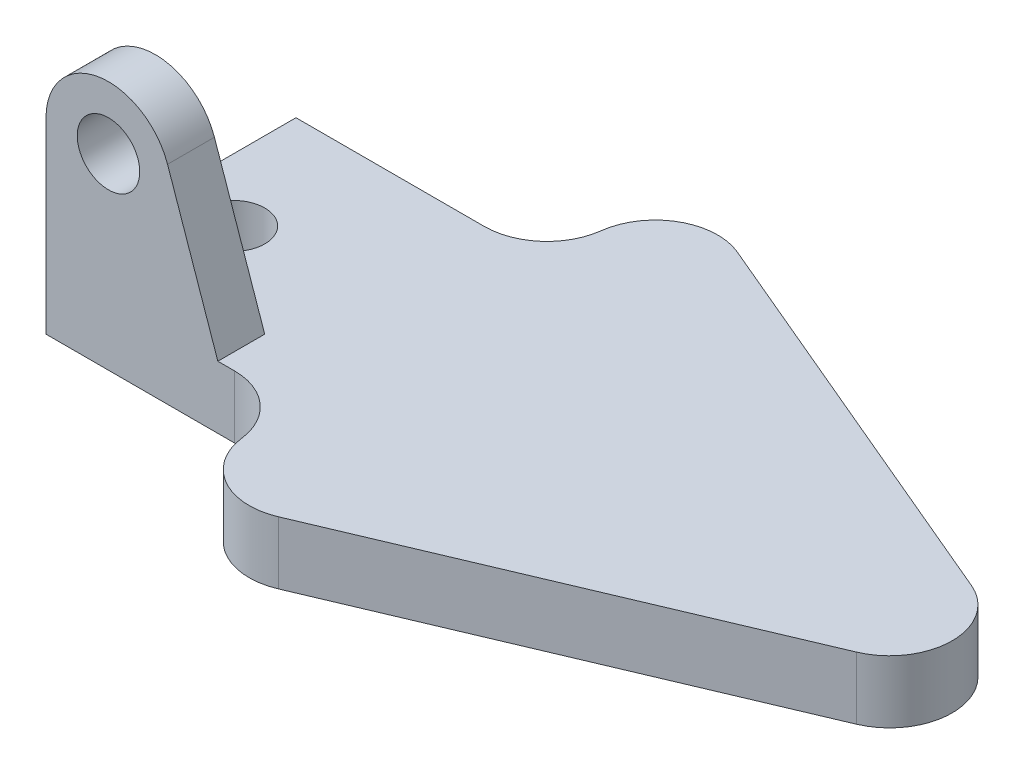
ISO-10303-21;
HEADER;
FILE_DESCRIPTION(('STEP AP214'),'2;1');
FILE_NAME('part.step','',(''),(''),'','','');
FILE_SCHEMA(('AUTOMOTIVE_DESIGN { 1 0 10303 214 1 1 1 1 }'));
ENDSEC;
DATA;
#1=APPLICATION_CONTEXT('core data for automotive mechanical design processes');
#2=APPLICATION_PROTOCOL_DEFINITION('international standard','automotive_design',2000,#1);
#3=PRODUCT_CONTEXT('',#1,'mechanical');
#4=PRODUCT('Part','Part','',(#3));
#5=PRODUCT_RELATED_PRODUCT_CATEGORY('part','',(#4));
#6=PRODUCT_DEFINITION_FORMATION('','',#4);
#7=PRODUCT_DEFINITION_CONTEXT('part definition',#1,'design');
#8=PRODUCT_DEFINITION('design','',#6,#7);
#9=PRODUCT_DEFINITION_SHAPE('','',#8);
#10=(LENGTH_UNIT() NAMED_UNIT(*) SI_UNIT(.MILLI.,.METRE.));
#11=(NAMED_UNIT(*) PLANE_ANGLE_UNIT() SI_UNIT($,.RADIAN.));
#12=(NAMED_UNIT(*) SI_UNIT($,.STERADIAN.) SOLID_ANGLE_UNIT());
#13=UNCERTAINTY_MEASURE_WITH_UNIT(LENGTH_MEASURE(1.E-05),#10,'distance_accuracy_value','');
#14=(GEOMETRIC_REPRESENTATION_CONTEXT(3) GLOBAL_UNCERTAINTY_ASSIGNED_CONTEXT((#13)) GLOBAL_UNIT_ASSIGNED_CONTEXT((#10,
#11,#12)) REPRESENTATION_CONTEXT('',''));
#15=CARTESIAN_POINT('',(0.,0.,0.));
#16=DIRECTION('',(0.,0.,1.));
#17=DIRECTION('',(1.,0.,0.));
#18=AXIS2_PLACEMENT_3D('',#15,#16,#17);
#19=CARTESIAN_POINT('',(-16.9663877764453,20.,-43.3264019782518));
#20=DIRECTION('',(0.,1.,0.));
#21=DIRECTION('',(0.,0.,1.));
#22=AXIS2_PLACEMENT_3D('',#19,#20,#21);
#23=PLANE('',#22);
#24=CARTESIAN_POINT('',(-57.2801181104764,20.,16.6735980217483));
#25=DIRECTION('',(0.,1.,0.));
#26=DIRECTION('',(0.,0.,1.));
#27=AXIS2_PLACEMENT_3D('',#24,#25,#26);
#28=CIRCLE('',#27,10.);
#29=CARTESIAN_POINT('',(-57.2801181104764,20.,26.6735980217483));
#30=VERTEX_POINT('',#29);
#31=EDGE_CURVE('E163',#30,#30,#28,.T.);
#32=ORIENTED_EDGE('',*,*,#31,.F.);
#33=EDGE_LOOP('',(#32));
#34=FACE_BOUND('',#33,.T.);
#35=DIRECTION('',(0.,0.,1.));
#36=VECTOR('',#35,1.);
#37=CARTESIAN_POINT('',(-77.2801181104764,20.,56.6735980217483));
#38=LINE('',#37,#36);
#39=CARTESIAN_POINT('',(-77.2801181104764,20.,-23.3264019782517));
#40=VERTEX_POINT('',#39);
#41=CARTESIAN_POINT('',(-77.2801181104764,20.,41.6735980217482));
#42=VERTEX_POINT('',#41);
#43=EDGE_CURVE('E112',#40,#42,#38,.T.);
#44=ORIENTED_EDGE('',*,*,#43,.T.);
#45=DIRECTION('',(1.,0.,0.));
#46=VECTOR('',#45,1.);
#47=CARTESIAN_POINT('',(-77.2801181104764,20.,41.6735980217482));
#48=LINE('',#47,#46);
#49=CARTESIAN_POINT('',(-22.2801181104764,20.,41.6735980217482));
#50=VERTEX_POINT('',#49);
#51=EDGE_CURVE('E246',#42,#50,#48,.T.);
#52=ORIENTED_EDGE('',*,*,#51,.T.);
#53=DIRECTION('',(0.,0.,1.));
#54=VECTOR('',#53,1.);
#55=CARTESIAN_POINT('',(-22.2801181104764,20.,41.6735980217482));
#56=LINE('',#55,#54);
#57=CARTESIAN_POINT('',(-22.2801181104764,20.,56.6735980217482));
#58=VERTEX_POINT('',#57);
#59=EDGE_CURVE('E239',#50,#58,#56,.T.);
#60=ORIENTED_EDGE('',*,*,#59,.T.);
#61=DIRECTION('',(1.,0.,0.));
#62=VECTOR('',#61,1.);
#63=CARTESIAN_POINT('',(-77.2801181104764,20.,56.6735980217483));
#64=LINE('',#63,#62);
#65=CARTESIAN_POINT('',(-16.9663877764453,20.,56.6735980217482));
#66=VERTEX_POINT('',#65);
#67=EDGE_CURVE('E227',#58,#66,#64,.T.);
#68=ORIENTED_EDGE('',*,*,#67,.T.);
#69=CARTESIAN_POINT('',(-16.9663877764453,20.,76.6735980217483));
#70=DIRECTION('',(0.,-1.,0.));
#71=DIRECTION('',(0.,0.,-1.));
#72=AXIS2_PLACEMENT_3D('',#69,#70,#71);
#73=CIRCLE('',#72,20.);
#74=CARTESIAN_POINT('',(2.87674705653915,20.,74.1735980217483));
#75=VERTEX_POINT('',#74);
#76=EDGE_CURVE('E224',#66,#75,#73,.T.);
#77=ORIENTED_EDGE('',*,*,#76,.T.);
#78=CARTESIAN_POINT('',(22.7198818895236,20.,71.6735980217482));
#79=DIRECTION('',(0.,1.,0.));
#80=DIRECTION('',(0.,0.,1.));
#81=AXIS2_PLACEMENT_3D('',#78,#79,#80);
#82=CIRCLE('',#81,20.);
#83=CARTESIAN_POINT('',(30.5126817062575,20.,90.0929430431194));
#84=VERTEX_POINT('',#83);
#85=EDGE_CURVE('E221',#75,#84,#82,.T.);
#86=ORIENTED_EDGE('',*,*,#85,.T.);
#87=DIRECTION('',(0.920967251068559,0.,-0.389639990836698));
#88=VECTOR('',#87,1.);
#89=CARTESIAN_POINT('',(30.5126817062575,20.,90.0929430431194));
#90=LINE('',#89,#88);
#91=CARTESIAN_POINT('',(160.512681706258,20.,35.0929430431194));
#92=VERTEX_POINT('',#91);
#93=EDGE_CURVE('E223',#84,#92,#90,.T.);
#94=ORIENTED_EDGE('',*,*,#93,.T.);
#95=CARTESIAN_POINT('',(152.719881889524,20.,16.6735980217483));
#96=DIRECTION('',(0.,1.,0.));
#97=DIRECTION('',(0.,0.,1.));
#98=AXIS2_PLACEMENT_3D('',#95,#96,#97);
#99=CIRCLE('',#98,20.);
#100=CARTESIAN_POINT('',(160.512681706258,20.,-1.74574699962293));
#101=VERTEX_POINT('',#100);
#102=EDGE_CURVE('E138',#92,#101,#99,.T.);
#103=ORIENTED_EDGE('',*,*,#102,.T.);
#104=DIRECTION('',(-0.920967251068559,0.,-0.389639990836698));
#105=VECTOR('',#104,1.);
#106=CARTESIAN_POINT('',(30.5126817062575,20.,-56.7457469996229));
#107=LINE('',#106,#105);
#108=CARTESIAN_POINT('',(30.5126817062575,20.,-56.7457469996229));
#109=VERTEX_POINT('',#108);
#110=EDGE_CURVE('E132',#101,#109,#107,.T.);
#111=ORIENTED_EDGE('',*,*,#110,.T.);
#112=CARTESIAN_POINT('',(22.7198818895236,20.,-38.3264019782517));
#113=DIRECTION('',(0.,1.,0.));
#114=DIRECTION('',(0.,0.,-1.));
#115=AXIS2_PLACEMENT_3D('',#112,#113,#114);
#116=CIRCLE('',#115,20.);
#117=CARTESIAN_POINT('',(2.87674705653914,20.,-40.8264019782518));
#118=VERTEX_POINT('',#117);
#119=EDGE_CURVE('E135',#109,#118,#116,.T.);
#120=ORIENTED_EDGE('',*,*,#119,.T.);
#121=CARTESIAN_POINT('',(-16.9663877764453,20.,-43.3264019782518));
#122=DIRECTION('',(0.,-1.,0.));
#123=DIRECTION('',(0.,0.,1.));
#124=AXIS2_PLACEMENT_3D('',#121,#122,#123);
#125=CIRCLE('',#124,20.);
#126=CARTESIAN_POINT('',(-16.9663877764453,20.,-23.3264019782518));
#127=VERTEX_POINT('',#126);
#128=EDGE_CURVE('E65',#118,#127,#125,.T.);
#129=ORIENTED_EDGE('',*,*,#128,.T.);
#130=DIRECTION('',(-1.,0.,0.));
#131=VECTOR('',#130,1.);
#132=CARTESIAN_POINT('',(-77.2801181104764,20.,-23.3264019782517));
#133=LINE('',#132,#131);
#134=EDGE_CURVE('E179',#127,#40,#133,.T.);
#135=ORIENTED_EDGE('',*,*,#134,.T.);
#136=EDGE_LOOP('',(#44,#52,#60,#68,#77,#86,#94,#103,#111,#120,#129,#135));
#137=FACE_BOUND('',#136,.T.);
#138=ADVANCED_FACE('F41',(#34,#137),#23,.T.);
#139=CARTESIAN_POINT('',(-16.9663877764453,0.,-43.3264019782518));
#140=DIRECTION('',(0.,1.,0.));
#141=DIRECTION('',(0.,0.,1.));
#142=AXIS2_PLACEMENT_3D('',#139,#140,#141);
#143=PLANE('',#142);
#144=DIRECTION('',(-1.,0.,0.));
#145=VECTOR('',#144,1.);
#146=CARTESIAN_POINT('',(-77.2801181104764,0.,-23.3264019782517));
#147=LINE('',#146,#145);
#148=CARTESIAN_POINT('',(-16.9663877764453,0.,-23.3264019782518));
#149=VERTEX_POINT('',#148);
#150=CARTESIAN_POINT('',(-77.2801181104764,0.,-23.3264019782517));
#151=VERTEX_POINT('',#150);
#152=EDGE_CURVE('E159',#149,#151,#147,.T.);
#153=ORIENTED_EDGE('',*,*,#152,.F.);
#154=CARTESIAN_POINT('',(-16.9663877764453,0.,-43.3264019782518));
#155=DIRECTION('',(0.,-1.,0.));
#156=DIRECTION('',(0.,0.,1.));
#157=AXIS2_PLACEMENT_3D('',#154,#155,#156);
#158=CIRCLE('',#157,20.);
#159=CARTESIAN_POINT('',(2.87674705653914,0.,-40.8264019782518));
#160=VERTEX_POINT('',#159);
#161=EDGE_CURVE('E104',#160,#149,#158,.T.);
#162=ORIENTED_EDGE('',*,*,#161,.F.);
#163=CARTESIAN_POINT('',(22.7198818895236,0.,-38.3264019782517));
#164=DIRECTION('',(0.,1.,0.));
#165=DIRECTION('',(0.,0.,-1.));
#166=AXIS2_PLACEMENT_3D('',#163,#164,#165);
#167=CIRCLE('',#166,20.);
#168=CARTESIAN_POINT('',(30.5126817062575,0.,-56.7457469996229));
#169=VERTEX_POINT('',#168);
#170=EDGE_CURVE('E176',#169,#160,#167,.T.);
#171=ORIENTED_EDGE('',*,*,#170,.F.);
#172=DIRECTION('',(-0.920967251068559,0.,-0.389639990836698));
#173=VECTOR('',#172,1.);
#174=CARTESIAN_POINT('',(30.5126817062575,0.,-56.7457469996229));
#175=LINE('',#174,#173);
#176=CARTESIAN_POINT('',(160.512681706258,0.,-1.74574699962293));
#177=VERTEX_POINT('',#176);
#178=EDGE_CURVE('E147',#177,#169,#175,.T.);
#179=ORIENTED_EDGE('',*,*,#178,.F.);
#180=CARTESIAN_POINT('',(152.719881889524,0.,16.6735980217483));
#181=DIRECTION('',(0.,1.,0.));
#182=DIRECTION('',(0.,0.,1.));
#183=AXIS2_PLACEMENT_3D('',#180,#181,#182);
#184=CIRCLE('',#183,20.);
#185=CARTESIAN_POINT('',(160.512681706258,0.,35.0929430431194));
#186=VERTEX_POINT('',#185);
#187=EDGE_CURVE('E173',#186,#177,#184,.T.);
#188=ORIENTED_EDGE('',*,*,#187,.F.);
#189=DIRECTION('',(0.920967251068559,0.,-0.389639990836698));
#190=VECTOR('',#189,1.);
#191=CARTESIAN_POINT('',(30.5126817062575,0.,90.0929430431194));
#192=LINE('',#191,#190);
#193=CARTESIAN_POINT('',(30.5126817062575,0.,90.0929430431194));
#194=VERTEX_POINT('',#193);
#195=EDGE_CURVE('E171',#194,#186,#192,.T.);
#196=ORIENTED_EDGE('',*,*,#195,.F.);
#197=CARTESIAN_POINT('',(22.7198818895236,0.,71.6735980217482));
#198=DIRECTION('',(0.,1.,0.));
#199=DIRECTION('',(0.,0.,1.));
#200=AXIS2_PLACEMENT_3D('',#197,#198,#199);
#201=CIRCLE('',#200,20.);
#202=CARTESIAN_POINT('',(2.87674705653915,0.,74.1735980217483));
#203=VERTEX_POINT('',#202);
#204=EDGE_CURVE('E169',#203,#194,#201,.T.);
#205=ORIENTED_EDGE('',*,*,#204,.F.);
#206=CARTESIAN_POINT('',(-16.9663877764453,0.,76.6735980217483));
#207=DIRECTION('',(0.,-1.,0.));
#208=DIRECTION('',(0.,0.,-1.));
#209=AXIS2_PLACEMENT_3D('',#206,#207,#208);
#210=CIRCLE('',#209,20.);
#211=CARTESIAN_POINT('',(-16.9663877764453,0.,56.6735980217482));
#212=VERTEX_POINT('',#211);
#213=EDGE_CURVE('E167',#212,#203,#210,.T.);
#214=ORIENTED_EDGE('',*,*,#213,.F.);
#215=DIRECTION('',(1.,0.,0.));
#216=VECTOR('',#215,1.);
#217=CARTESIAN_POINT('',(-77.2801181104764,0.,56.6735980217483));
#218=LINE('',#217,#216);
#219=CARTESIAN_POINT('',(-77.2801181104764,0.,56.6735980217483));
#220=VERTEX_POINT('',#219);
#221=EDGE_CURVE('E165',#220,#212,#218,.T.);
#222=ORIENTED_EDGE('',*,*,#221,.F.);
#223=DIRECTION('',(0.,0.,1.));
#224=VECTOR('',#223,1.);
#225=CARTESIAN_POINT('',(-77.2801181104764,0.,56.6735980217483));
#226=LINE('',#225,#224);
#227=EDGE_CURVE('E162',#151,#220,#226,.T.);
#228=ORIENTED_EDGE('',*,*,#227,.F.);
#229=EDGE_LOOP('',(#153,#162,#171,#179,#188,#196,#205,#214,#222,#228));
#230=FACE_BOUND('',#229,.T.);
#231=CARTESIAN_POINT('',(-57.2801181104764,0.,16.6735980217483));
#232=DIRECTION('',(0.,1.,0.));
#233=DIRECTION('',(0.,0.,1.));
#234=AXIS2_PLACEMENT_3D('',#231,#232,#233);
#235=CIRCLE('',#234,10.);
#236=CARTESIAN_POINT('',(-57.2801181104764,0.,26.6735980217483));
#237=VERTEX_POINT('',#236);
#238=EDGE_CURVE('E233',#237,#237,#235,.T.);
#239=ORIENTED_EDGE('',*,*,#238,.T.);
#240=EDGE_LOOP('',(#239));
#241=FACE_BOUND('',#240,.T.);
#242=ADVANCED_FACE('F209',(#230,#241),#143,.F.);
#243=CARTESIAN_POINT('',(-77.2801181104764,20.,-23.3264019782517));
#244=DIRECTION('',(0.,0.,1.));
#245=DIRECTION('',(1.,0.,0.));
#246=AXIS2_PLACEMENT_3D('',#243,#244,#245);
#247=PLANE('',#246);
#248=ORIENTED_EDGE('',*,*,#152,.T.);
#249=DIRECTION('',(0.,-1.,0.));
#250=VECTOR('',#249,1.);
#251=CARTESIAN_POINT('',(-77.2801181104764,20.,-23.3264019782517));
#252=LINE('',#251,#250);
#253=EDGE_CURVE('E11',#40,#151,#252,.T.);
#254=ORIENTED_EDGE('',*,*,#253,.F.);
#255=ORIENTED_EDGE('',*,*,#134,.F.);
#256=DIRECTION('',(0.,-1.,0.));
#257=VECTOR('',#256,1.);
#258=CARTESIAN_POINT('',(-16.9663877764453,20.,-23.3264019782518));
#259=LINE('',#258,#257);
#260=EDGE_CURVE('E155',#127,#149,#259,.T.);
#261=ORIENTED_EDGE('',*,*,#260,.T.);
#262=EDGE_LOOP('',(#248,#254,#255,#261));
#263=FACE_BOUND('',#262,.T.);
#264=ADVANCED_FACE('F43',(#263),#247,.F.);
#265=CARTESIAN_POINT('',(-77.2801181104764,20.,56.6735980217483));
#266=DIRECTION('',(1.,0.,0.));
#267=DIRECTION('',(0.,0.,-1.));
#268=AXIS2_PLACEMENT_3D('',#265,#266,#267);
#269=PLANE('',#268);
#270=ORIENTED_EDGE('',*,*,#227,.T.);
#271=DIRECTION('',(0.,-1.,0.));
#272=VECTOR('',#271,1.);
#273=CARTESIAN_POINT('',(-77.2801181104764,20.,56.6735980217483));
#274=LINE('',#273,#272);
#275=CARTESIAN_POINT('',(-77.2801181104764,60.,56.6735980217482));
#276=VERTEX_POINT('',#275);
#277=EDGE_CURVE('E49',#276,#220,#274,.T.);
#278=ORIENTED_EDGE('',*,*,#277,.F.);
#279=DIRECTION('',(0.,0.,1.));
#280=VECTOR('',#279,1.);
#281=CARTESIAN_POINT('',(-77.2801181104764,60.,41.6735980217482));
#282=LINE('',#281,#280);
#283=CARTESIAN_POINT('',(-77.2801181104764,60.,41.6735980217482));
#284=VERTEX_POINT('',#283);
#285=EDGE_CURVE('E236',#284,#276,#282,.T.);
#286=ORIENTED_EDGE('',*,*,#285,.F.);
#287=DIRECTION('',(0.,-1.,0.));
#288=VECTOR('',#287,1.);
#289=CARTESIAN_POINT('',(-77.2801181104764,20.,41.6735980217482));
#290=LINE('',#289,#288);
#291=EDGE_CURVE('E242',#284,#42,#290,.T.);
#292=ORIENTED_EDGE('',*,*,#291,.T.);
#293=ORIENTED_EDGE('',*,*,#43,.F.);
#294=ORIENTED_EDGE('',*,*,#253,.T.);
#295=EDGE_LOOP('',(#270,#278,#286,#292,#293,#294));
#296=FACE_BOUND('',#295,.T.);
#297=ADVANCED_FACE('F273',(#296),#269,.F.);
#298=CARTESIAN_POINT('',(-77.2801181104764,20.,56.6735980217483));
#299=DIRECTION('',(0.,0.,-1.));
#300=DIRECTION('',(-1.,0.,0.));
#301=AXIS2_PLACEMENT_3D('',#298,#299,#300);
#302=PLANE('',#301);
#303=ORIENTED_EDGE('',*,*,#221,.T.);
#304=DIRECTION('',(0.,-1.,0.));
#305=VECTOR('',#304,1.);
#306=CARTESIAN_POINT('',(-16.9663877764453,20.,56.6735980217482));
#307=LINE('',#306,#305);
#308=EDGE_CURVE('E192',#66,#212,#307,.T.);
#309=ORIENTED_EDGE('',*,*,#308,.F.);
#310=ORIENTED_EDGE('',*,*,#67,.F.);
#311=DIRECTION('',(-0.326920394801529,0.945051879773175,0.));
#312=VECTOR('',#311,1.);
#313=CARTESIAN_POINT('',(-38.3790805150129,66.5384078960306,56.6735980217482));
#314=LINE('',#313,#312);
#315=CARTESIAN_POINT('',(-38.3790805150129,66.5384078960306,56.6735980217482));
#316=VERTEX_POINT('',#315);
#317=EDGE_CURVE('E56',#58,#316,#314,.T.);
#318=ORIENTED_EDGE('',*,*,#317,.T.);
#319=CARTESIAN_POINT('',(-57.2801181104764,60.,56.6735980217482));
#320=DIRECTION('',(0.,0.,1.));
#321=DIRECTION('',(-1.,0.,0.));
#322=AXIS2_PLACEMENT_3D('',#319,#320,#321);
#323=CIRCLE('',#322,20.);
#324=EDGE_CURVE('E203',#316,#276,#323,.T.);
#325=ORIENTED_EDGE('',*,*,#324,.T.);
#326=ORIENTED_EDGE('',*,*,#277,.T.);
#327=EDGE_LOOP('',(#303,#309,#310,#318,#325,#326));
#328=FACE_BOUND('',#327,.T.);
#329=CARTESIAN_POINT('',(-57.2801181104764,60.,56.6735980217482));
#330=DIRECTION('',(0.,0.,1.));
#331=DIRECTION('',(1.,0.,0.));
#332=AXIS2_PLACEMENT_3D('',#329,#330,#331);
#333=CIRCLE('',#332,10.);
#334=CARTESIAN_POINT('',(-47.2801181104764,60.,56.6735980217482));
#335=VERTEX_POINT('',#334);
#336=EDGE_CURVE('E258',#335,#335,#333,.T.);
#337=ORIENTED_EDGE('',*,*,#336,.F.);
#338=EDGE_LOOP('',(#337));
#339=FACE_BOUND('',#338,.T.);
#340=ADVANCED_FACE('F199',(#328,#339),#302,.F.);
#341=CARTESIAN_POINT('',(-16.9663877764453,20.,76.6735980217483));
#342=DIRECTION('',(0.,-1.,0.));
#343=DIRECTION('',(0.,0.,-1.));
#344=AXIS2_PLACEMENT_3D('',#341,#342,#343);
#345=CYLINDRICAL_SURFACE('',#344,20.);
#346=ORIENTED_EDGE('',*,*,#213,.T.);
#347=DIRECTION('',(0.,-1.,0.));
#348=VECTOR('',#347,1.);
#349=CARTESIAN_POINT('',(2.87674705653915,20.,74.1735980217483));
#350=LINE('',#349,#348);
#351=EDGE_CURVE('E189',#75,#203,#350,.T.);
#352=ORIENTED_EDGE('',*,*,#351,.F.);
#353=ORIENTED_EDGE('',*,*,#76,.F.);
#354=ORIENTED_EDGE('',*,*,#308,.T.);
#355=EDGE_LOOP('',(#346,#352,#353,#354));
#356=FACE_BOUND('',#355,.T.);
#357=ADVANCED_FACE('F215',(#356),#345,.F.);
#358=CARTESIAN_POINT('',(22.7198818895236,20.,71.6735980217482));
#359=DIRECTION('',(0.,-1.,0.));
#360=DIRECTION('',(0.,0.,-1.));
#361=AXIS2_PLACEMENT_3D('',#358,#359,#360);
#362=CYLINDRICAL_SURFACE('',#361,20.);
#363=ORIENTED_EDGE('',*,*,#204,.T.);
#364=DIRECTION('',(0.,-1.,0.));
#365=VECTOR('',#364,1.);
#366=CARTESIAN_POINT('',(30.5126817062575,20.,90.0929430431194));
#367=LINE('',#366,#365);
#368=EDGE_CURVE('E186',#84,#194,#367,.T.);
#369=ORIENTED_EDGE('',*,*,#368,.F.);
#370=ORIENTED_EDGE('',*,*,#85,.F.);
#371=ORIENTED_EDGE('',*,*,#351,.T.);
#372=EDGE_LOOP('',(#363,#369,#370,#371));
#373=FACE_BOUND('',#372,.T.);
#374=ADVANCED_FACE('F219',(#373),#362,.T.);
#375=CARTESIAN_POINT('',(30.5126817062575,20.,90.0929430431194));
#376=DIRECTION('',(-0.389639990836698,0.,-0.920967251068559));
#377=DIRECTION('',(-0.920967251068559,0.,0.389639990836698));
#378=AXIS2_PLACEMENT_3D('',#375,#376,#377);
#379=PLANE('',#378);
#380=ORIENTED_EDGE('',*,*,#195,.T.);
#381=DIRECTION('',(0.,-1.,0.));
#382=VECTOR('',#381,1.);
#383=CARTESIAN_POINT('',(160.512681706258,20.,35.0929430431194));
#384=LINE('',#383,#382);
#385=EDGE_CURVE('E183',#92,#186,#384,.T.);
#386=ORIENTED_EDGE('',*,*,#385,.F.);
#387=ORIENTED_EDGE('',*,*,#93,.F.);
#388=ORIENTED_EDGE('',*,*,#368,.T.);
#389=EDGE_LOOP('',(#380,#386,#387,#388));
#390=FACE_BOUND('',#389,.T.);
#391=ADVANCED_FACE('F305',(#390),#379,.F.);
#392=CARTESIAN_POINT('',(152.719881889524,20.,16.6735980217483));
#393=DIRECTION('',(0.,-1.,0.));
#394=DIRECTION('',(0.,0.,-1.));
#395=AXIS2_PLACEMENT_3D('',#392,#393,#394);
#396=CYLINDRICAL_SURFACE('',#395,20.);
#397=ORIENTED_EDGE('',*,*,#187,.T.);
#398=DIRECTION('',(0.,-1.,0.));
#399=VECTOR('',#398,1.);
#400=CARTESIAN_POINT('',(160.512681706258,20.,-1.74574699962293));
#401=LINE('',#400,#399);
#402=EDGE_CURVE('E150',#101,#177,#401,.T.);
#403=ORIENTED_EDGE('',*,*,#402,.F.);
#404=ORIENTED_EDGE('',*,*,#102,.F.);
#405=ORIENTED_EDGE('',*,*,#385,.T.);
#406=EDGE_LOOP('',(#397,#403,#404,#405));
#407=FACE_BOUND('',#406,.T.);
#408=ADVANCED_FACE('F302',(#407),#396,.T.);
#409=CARTESIAN_POINT('',(30.5126817062575,20.,-56.7457469996229));
#410=DIRECTION('',(-0.389639990836698,0.,0.920967251068559));
#411=DIRECTION('',(0.920967251068559,0.,0.389639990836698));
#412=AXIS2_PLACEMENT_3D('',#409,#410,#411);
#413=PLANE('',#412);
#414=ORIENTED_EDGE('',*,*,#178,.T.);
#415=DIRECTION('',(0.,-1.,0.));
#416=VECTOR('',#415,1.);
#417=CARTESIAN_POINT('',(30.5126817062575,20.,-56.7457469996229));
#418=LINE('',#417,#416);
#419=EDGE_CURVE('E144',#109,#169,#418,.T.);
#420=ORIENTED_EDGE('',*,*,#419,.F.);
#421=ORIENTED_EDGE('',*,*,#110,.F.);
#422=ORIENTED_EDGE('',*,*,#402,.T.);
#423=EDGE_LOOP('',(#414,#420,#421,#422));
#424=FACE_BOUND('',#423,.T.);
#425=ADVANCED_FACE('F145',(#424),#413,.F.);
#426=CARTESIAN_POINT('',(22.7198818895236,20.,-38.3264019782517));
#427=DIRECTION('',(0.,-1.,0.));
#428=DIRECTION('',(0.,0.,-1.));
#429=AXIS2_PLACEMENT_3D('',#426,#427,#428);
#430=CYLINDRICAL_SURFACE('',#429,20.);
#431=ORIENTED_EDGE('',*,*,#170,.T.);
#432=DIRECTION('',(0.,-1.,0.));
#433=VECTOR('',#432,1.);
#434=CARTESIAN_POINT('',(2.87674705653914,20.,-40.8264019782518));
#435=LINE('',#434,#433);
#436=EDGE_CURVE('E151',#118,#160,#435,.T.);
#437=ORIENTED_EDGE('',*,*,#436,.F.);
#438=ORIENTED_EDGE('',*,*,#119,.F.);
#439=ORIENTED_EDGE('',*,*,#419,.T.);
#440=EDGE_LOOP('',(#431,#437,#438,#439));
#441=FACE_BOUND('',#440,.T.);
#442=ADVANCED_FACE('F153',(#441),#430,.T.);
#443=CARTESIAN_POINT('',(-16.9663877764453,20.,-43.3264019782518));
#444=DIRECTION('',(0.,-1.,0.));
#445=DIRECTION('',(0.,0.,-1.));
#446=AXIS2_PLACEMENT_3D('',#443,#444,#445);
#447=CYLINDRICAL_SURFACE('',#446,20.);
#448=ORIENTED_EDGE('',*,*,#161,.T.);
#449=ORIENTED_EDGE('',*,*,#260,.F.);
#450=ORIENTED_EDGE('',*,*,#128,.F.);
#451=ORIENTED_EDGE('',*,*,#436,.T.);
#452=EDGE_LOOP('',(#448,#449,#450,#451));
#453=FACE_BOUND('',#452,.T.);
#454=ADVANCED_FACE('F295',(#453),#447,.F.);
#455=CARTESIAN_POINT('',(-57.2801181104764,20.,16.6735980217483));
#456=DIRECTION('',(0.,-1.,0.));
#457=DIRECTION('',(0.,0.,-1.));
#458=AXIS2_PLACEMENT_3D('',#455,#456,#457);
#459=CYLINDRICAL_SURFACE('',#458,10.);
#460=ORIENTED_EDGE('',*,*,#31,.T.);
#461=EDGE_LOOP('',(#460));
#462=FACE_BOUND('',#461,.T.);
#463=ORIENTED_EDGE('',*,*,#238,.F.);
#464=EDGE_LOOP('',(#463));
#465=FACE_BOUND('',#464,.T.);
#466=ADVANCED_FACE('F292',(#462,#465),#459,.F.);
#467=CARTESIAN_POINT('',(-57.2801181104764,60.,41.6735980217482));
#468=DIRECTION('',(0.,0.,1.));
#469=DIRECTION('',(1.,0.,0.));
#470=AXIS2_PLACEMENT_3D('',#467,#468,#469);
#471=CYLINDRICAL_SURFACE('',#470,20.);
#472=ORIENTED_EDGE('',*,*,#324,.F.);
#473=DIRECTION('',(0.,0.,1.));
#474=VECTOR('',#473,1.);
#475=CARTESIAN_POINT('',(-38.3790805150129,66.5384078960306,41.6735980217482));
#476=LINE('',#475,#474);
#477=CARTESIAN_POINT('',(-38.3790805150129,66.5384078960306,41.6735980217482));
#478=VERTEX_POINT('',#477);
#479=EDGE_CURVE('E241',#478,#316,#476,.T.);
#480=ORIENTED_EDGE('',*,*,#479,.F.);
#481=CARTESIAN_POINT('',(-57.2801181104764,60.,41.6735980217482));
#482=DIRECTION('',(0.,0.,1.));
#483=DIRECTION('',(-1.,0.,0.));
#484=AXIS2_PLACEMENT_3D('',#481,#482,#483);
#485=CIRCLE('',#484,20.);
#486=EDGE_CURVE('E250',#478,#284,#485,.T.);
#487=ORIENTED_EDGE('',*,*,#486,.T.);
#488=ORIENTED_EDGE('',*,*,#285,.T.);
#489=EDGE_LOOP('',(#472,#480,#487,#488));
#490=FACE_BOUND('',#489,.T.);
#491=ADVANCED_FACE('F341',(#490),#471,.T.);
#492=CARTESIAN_POINT('',(-38.3790805150129,66.5384078960306,41.6735980217482));
#493=DIRECTION('',(0.945051879773175,0.326920394801529,0.));
#494=DIRECTION('',(-0.326920394801529,0.945051879773176,0.));
#495=AXIS2_PLACEMENT_3D('',#492,#493,#494);
#496=PLANE('',#495);
#497=ORIENTED_EDGE('',*,*,#317,.F.);
#498=ORIENTED_EDGE('',*,*,#59,.F.);
#499=DIRECTION('',(-0.326920394801529,0.945051879773175,0.));
#500=VECTOR('',#499,1.);
#501=CARTESIAN_POINT('',(-38.3790805150129,66.5384078960306,41.6735980217482));
#502=LINE('',#501,#500);
#503=EDGE_CURVE('E253',#50,#478,#502,.T.);
#504=ORIENTED_EDGE('',*,*,#503,.T.);
#505=ORIENTED_EDGE('',*,*,#479,.T.);
#506=EDGE_LOOP('',(#497,#498,#504,#505));
#507=FACE_BOUND('',#506,.T.);
#508=ADVANCED_FACE('F364',(#507),#496,.T.);
#509=CARTESIAN_POINT('',(-57.2801181104764,60.,41.6735980217482));
#510=DIRECTION('',(0.,0.,-1.));
#511=DIRECTION('',(-1.,0.,0.));
#512=AXIS2_PLACEMENT_3D('',#509,#510,#511);
#513=PLANE('',#512);
#514=CARTESIAN_POINT('',(-57.2801181104764,60.,41.6735980217482));
#515=DIRECTION('',(0.,0.,1.));
#516=DIRECTION('',(1.,0.,0.));
#517=AXIS2_PLACEMENT_3D('',#514,#515,#516);
#518=CIRCLE('',#517,10.);
#519=CARTESIAN_POINT('',(-47.2801181104764,60.,41.6735980217482));
#520=VERTEX_POINT('',#519);
#521=EDGE_CURVE('E248',#520,#520,#518,.T.);
#522=ORIENTED_EDGE('',*,*,#521,.T.);
#523=EDGE_LOOP('',(#522));
#524=FACE_BOUND('',#523,.T.);
#525=ORIENTED_EDGE('',*,*,#51,.F.);
#526=ORIENTED_EDGE('',*,*,#291,.F.);
#527=ORIENTED_EDGE('',*,*,#486,.F.);
#528=ORIENTED_EDGE('',*,*,#503,.F.);
#529=EDGE_LOOP('',(#525,#526,#527,#528));
#530=FACE_BOUND('',#529,.T.);
#531=ADVANCED_FACE('F264',(#524,#530),#513,.T.);
#532=CARTESIAN_POINT('',(-57.2801181104764,60.,41.6735980217482));
#533=DIRECTION('',(0.,0.,1.));
#534=DIRECTION('',(1.,0.,0.));
#535=AXIS2_PLACEMENT_3D('',#532,#533,#534);
#536=CYLINDRICAL_SURFACE('',#535,10.);
#537=ORIENTED_EDGE('',*,*,#521,.F.);
#538=EDGE_LOOP('',(#537));
#539=FACE_BOUND('',#538,.T.);
#540=ORIENTED_EDGE('',*,*,#336,.T.);
#541=EDGE_LOOP('',(#540));
#542=FACE_BOUND('',#541,.T.);
#543=ADVANCED_FACE('F267',(#539,#542),#536,.F.);
#544=CLOSED_SHELL('',(#138,#242,#264,#297,#340,#357,#374,#391,#408,#425,#442,#454,#466,#491,
#508,#531,#543));
#545=MANIFOLD_SOLID_BREP('B2',#544);
#546=ADVANCED_BREP_SHAPE_REPRESENTATION('',(#18,#545),#14);
#547=SHAPE_DEFINITION_REPRESENTATION(#9,#546);
ENDSEC;
END-ISO-10303-21;
